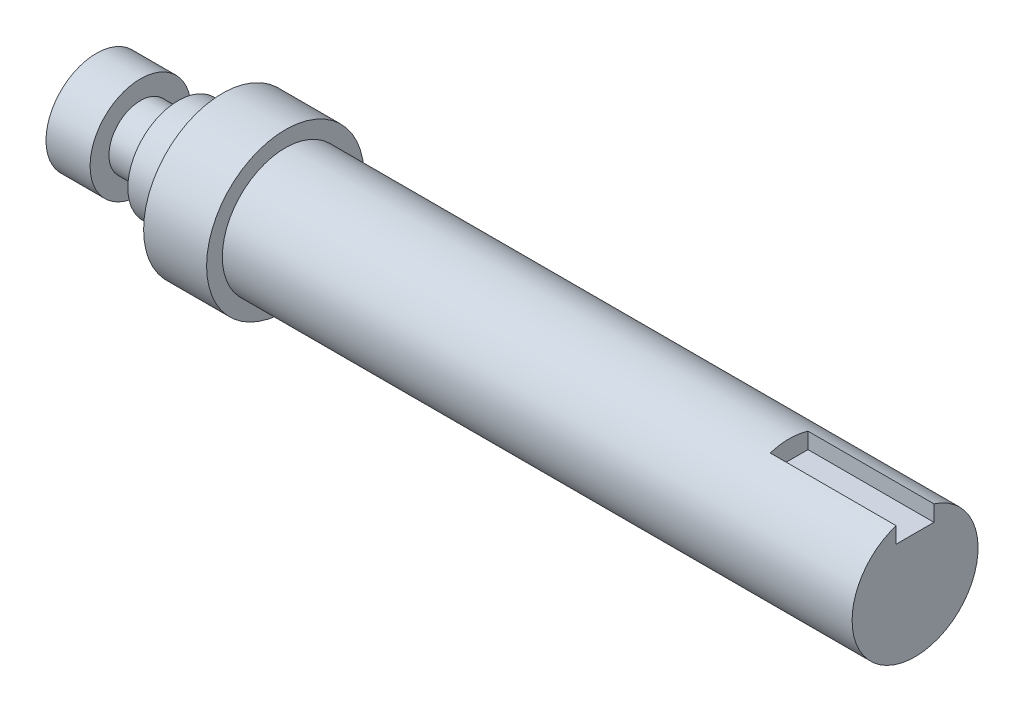
ISO-10303-21;
HEADER;
FILE_DESCRIPTION(('STEP AP214'),'2;1');
FILE_NAME('part.step','',(''),(''),'','','');
FILE_SCHEMA(('AUTOMOTIVE_DESIGN { 1 0 10303 214 1 1 1 1 }'));
ENDSEC;
DATA;
#1=APPLICATION_CONTEXT('core data for automotive mechanical design processes');
#2=APPLICATION_PROTOCOL_DEFINITION('international standard','automotive_design',2000,#1);
#3=PRODUCT_CONTEXT('',#1,'mechanical');
#4=PRODUCT('Part','Part','',(#3));
#5=PRODUCT_RELATED_PRODUCT_CATEGORY('part','',(#4));
#6=PRODUCT_DEFINITION_FORMATION('','',#4);
#7=PRODUCT_DEFINITION_CONTEXT('part definition',#1,'design');
#8=PRODUCT_DEFINITION('design','',#6,#7);
#9=PRODUCT_DEFINITION_SHAPE('','',#8);
#10=(LENGTH_UNIT() NAMED_UNIT(*) SI_UNIT(.MILLI.,.METRE.));
#11=(NAMED_UNIT(*) PLANE_ANGLE_UNIT() SI_UNIT($,.RADIAN.));
#12=(NAMED_UNIT(*) SI_UNIT($,.STERADIAN.) SOLID_ANGLE_UNIT());
#13=UNCERTAINTY_MEASURE_WITH_UNIT(LENGTH_MEASURE(1.E-05),#10,'distance_accuracy_value','');
#14=(GEOMETRIC_REPRESENTATION_CONTEXT(3) GLOBAL_UNCERTAINTY_ASSIGNED_CONTEXT((#13)) GLOBAL_UNIT_ASSIGNED_CONTEXT((#10,
#11,#12)) REPRESENTATION_CONTEXT('',''));
#15=CARTESIAN_POINT('',(0.,0.,0.));
#16=DIRECTION('',(0.,0.,1.));
#17=DIRECTION('',(1.,0.,0.));
#18=AXIS2_PLACEMENT_3D('',#15,#16,#17);
#19=CARTESIAN_POINT('',(-65.,0.,0.));
#20=DIRECTION('',(1.,0.,0.));
#21=DIRECTION('',(0.,0.,-1.));
#22=AXIS2_PLACEMENT_3D('',#19,#20,#21);
#23=PLANE('',#22);
#24=CARTESIAN_POINT('',(-65.,0.,0.));
#25=DIRECTION('',(-1.,0.,0.));
#26=DIRECTION('',(0.,0.,1.));
#27=AXIS2_PLACEMENT_3D('',#24,#25,#26);
#28=CIRCLE('',#27,8.00000000000001);
#29=CARTESIAN_POINT('',(-65.,0.,8.00000000000001));
#30=VERTEX_POINT('',#29);
#31=EDGE_CURVE('E11',#30,#30,#28,.T.);
#32=ORIENTED_EDGE('',*,*,#31,.T.);
#33=EDGE_LOOP('',(#32));
#34=FACE_BOUND('',#33,.T.);
#35=ADVANCED_FACE('F39',(#34),#23,.F.);
#36=CARTESIAN_POINT('',(-30.4262295081967,0.,0.));
#37=DIRECTION('',(-1.,0.,0.));
#38=DIRECTION('',(0.,0.,1.));
#39=AXIS2_PLACEMENT_3D('',#36,#37,#38);
#40=CYLINDRICAL_SURFACE('',#39,8.00000000000001);
#41=ORIENTED_EDGE('',*,*,#31,.F.);
#42=EDGE_LOOP('',(#41));
#43=FACE_BOUND('',#42,.T.);
#44=CARTESIAN_POINT('',(-58.,0.,0.));
#45=DIRECTION('',(-1.,0.,0.));
#46=DIRECTION('',(0.,0.,1.));
#47=AXIS2_PLACEMENT_3D('',#44,#45,#46);
#48=CIRCLE('',#47,8.00000000000001);
#49=CARTESIAN_POINT('',(-58.,0.,8.00000000000001));
#50=VERTEX_POINT('',#49);
#51=EDGE_CURVE('E47',#50,#50,#48,.T.);
#52=ORIENTED_EDGE('',*,*,#51,.T.);
#53=EDGE_LOOP('',(#52));
#54=FACE_BOUND('',#53,.T.);
#55=ADVANCED_FACE('F159',(#43,#54),#40,.T.);
#56=CARTESIAN_POINT('',(-58.,8.00000000000001,0.));
#57=DIRECTION('',(-1.,0.,0.));
#58=DIRECTION('',(0.,0.,1.));
#59=AXIS2_PLACEMENT_3D('',#56,#57,#58);
#60=PLANE('',#59);
#61=ORIENTED_EDGE('',*,*,#51,.F.);
#62=EDGE_LOOP('',(#61));
#63=FACE_BOUND('',#62,.T.);
#64=CARTESIAN_POINT('',(-58.,0.,0.));
#65=DIRECTION('',(-1.,0.,0.));
#66=DIRECTION('',(0.,0.,1.));
#67=AXIS2_PLACEMENT_3D('',#64,#65,#66);
#68=CIRCLE('',#67,5.00000000000001);
#69=CARTESIAN_POINT('',(-58.,0.,5.00000000000001));
#70=VERTEX_POINT('',#69);
#71=EDGE_CURVE('E152',#70,#70,#68,.T.);
#72=ORIENTED_EDGE('',*,*,#71,.T.);
#73=EDGE_LOOP('',(#72));
#74=FACE_BOUND('',#73,.T.);
#75=ADVANCED_FACE('F161',(#63,#74),#60,.F.);
#76=CARTESIAN_POINT('',(-30.4262295081967,0.,0.));
#77=DIRECTION('',(-1.,0.,0.));
#78=DIRECTION('',(0.,0.,1.));
#79=AXIS2_PLACEMENT_3D('',#76,#77,#78);
#80=CYLINDRICAL_SURFACE('',#79,5.00000000000001);
#81=ORIENTED_EDGE('',*,*,#71,.F.);
#82=EDGE_LOOP('',(#81));
#83=FACE_BOUND('',#82,.T.);
#84=CARTESIAN_POINT('',(-52.,0.,0.));
#85=DIRECTION('',(-1.,0.,0.));
#86=DIRECTION('',(0.,0.,1.));
#87=AXIS2_PLACEMENT_3D('',#84,#85,#86);
#88=CIRCLE('',#87,5.00000000000001);
#89=CARTESIAN_POINT('',(-52.,0.,5.00000000000001));
#90=VERTEX_POINT('',#89);
#91=EDGE_CURVE('E148',#90,#90,#88,.T.);
#92=ORIENTED_EDGE('',*,*,#91,.T.);
#93=EDGE_LOOP('',(#92));
#94=FACE_BOUND('',#93,.T.);
#95=ADVANCED_FACE('F164',(#83,#94),#80,.T.);
#96=CARTESIAN_POINT('',(-52.,5.00000000000001,0.));
#97=DIRECTION('',(1.,0.,0.));
#98=DIRECTION('',(0.,0.,-1.));
#99=AXIS2_PLACEMENT_3D('',#96,#97,#98);
#100=PLANE('',#99);
#101=ORIENTED_EDGE('',*,*,#91,.F.);
#102=EDGE_LOOP('',(#101));
#103=FACE_BOUND('',#102,.T.);
#104=CARTESIAN_POINT('',(-52.,0.,0.));
#105=DIRECTION('',(-1.,0.,0.));
#106=DIRECTION('',(0.,0.,1.));
#107=AXIS2_PLACEMENT_3D('',#104,#105,#106);
#108=CIRCLE('',#107,8.00000000000001);
#109=CARTESIAN_POINT('',(-52.,0.,8.00000000000001));
#110=VERTEX_POINT('',#109);
#111=EDGE_CURVE('E144',#110,#110,#108,.T.);
#112=ORIENTED_EDGE('',*,*,#111,.T.);
#113=EDGE_LOOP('',(#112));
#114=FACE_BOUND('',#113,.T.);
#115=ADVANCED_FACE('F170',(#103,#114),#100,.F.);
#116=CARTESIAN_POINT('',(-30.4262295081967,0.,0.));
#117=DIRECTION('',(-1.,0.,0.));
#118=DIRECTION('',(0.,0.,1.));
#119=AXIS2_PLACEMENT_3D('',#116,#117,#118);
#120=CYLINDRICAL_SURFACE('',#119,8.00000000000001);
#121=ORIENTED_EDGE('',*,*,#111,.F.);
#122=EDGE_LOOP('',(#121));
#123=FACE_BOUND('',#122,.T.);
#124=CARTESIAN_POINT('',(-45.,0.,0.));
#125=DIRECTION('',(-1.,0.,0.));
#126=DIRECTION('',(0.,0.,1.));
#127=AXIS2_PLACEMENT_3D('',#124,#125,#126);
#128=CIRCLE('',#127,8.00000000000001);
#129=CARTESIAN_POINT('',(-45.,0.,8.00000000000001));
#130=VERTEX_POINT('',#129);
#131=EDGE_CURVE('E140',#130,#130,#128,.T.);
#132=ORIENTED_EDGE('',*,*,#131,.T.);
#133=EDGE_LOOP('',(#132));
#134=FACE_BOUND('',#133,.T.);
#135=ADVANCED_FACE('F176',(#123,#134),#120,.T.);
#136=CARTESIAN_POINT('',(-45.,8.00000000000001,0.));
#137=DIRECTION('',(1.,0.,0.));
#138=DIRECTION('',(0.,0.,-1.));
#139=AXIS2_PLACEMENT_3D('',#136,#137,#138);
#140=PLANE('',#139);
#141=ORIENTED_EDGE('',*,*,#131,.F.);
#142=EDGE_LOOP('',(#141));
#143=FACE_BOUND('',#142,.T.);
#144=CARTESIAN_POINT('',(-45.,0.,0.));
#145=DIRECTION('',(-1.,0.,0.));
#146=DIRECTION('',(0.,0.,1.));
#147=AXIS2_PLACEMENT_3D('',#144,#145,#146);
#148=CIRCLE('',#147,12.5);
#149=CARTESIAN_POINT('',(-45.,0.,12.5));
#150=VERTEX_POINT('',#149);
#151=EDGE_CURVE('E136',#150,#150,#148,.T.);
#152=ORIENTED_EDGE('',*,*,#151,.T.);
#153=EDGE_LOOP('',(#152));
#154=FACE_BOUND('',#153,.T.);
#155=ADVANCED_FACE('F182',(#143,#154),#140,.F.);
#156=CARTESIAN_POINT('',(-30.4262295081967,0.,0.));
#157=DIRECTION('',(-1.,0.,0.));
#158=DIRECTION('',(0.,0.,1.));
#159=AXIS2_PLACEMENT_3D('',#156,#157,#158);
#160=CYLINDRICAL_SURFACE('',#159,12.5);
#161=ORIENTED_EDGE('',*,*,#151,.F.);
#162=EDGE_LOOP('',(#161));
#163=FACE_BOUND('',#162,.T.);
#164=CARTESIAN_POINT('',(-35.,0.,0.));
#165=DIRECTION('',(-1.,0.,0.));
#166=DIRECTION('',(0.,0.,1.));
#167=AXIS2_PLACEMENT_3D('',#164,#165,#166);
#168=CIRCLE('',#167,12.5);
#169=CARTESIAN_POINT('',(-35.,0.,12.5));
#170=VERTEX_POINT('',#169);
#171=EDGE_CURVE('E132',#170,#170,#168,.T.);
#172=ORIENTED_EDGE('',*,*,#171,.T.);
#173=EDGE_LOOP('',(#172));
#174=FACE_BOUND('',#173,.T.);
#175=ADVANCED_FACE('F188',(#163,#174),#160,.T.);
#176=CARTESIAN_POINT('',(-35.,12.5,0.));
#177=DIRECTION('',(-1.,0.,0.));
#178=DIRECTION('',(0.,0.,1.));
#179=AXIS2_PLACEMENT_3D('',#176,#177,#178);
#180=PLANE('',#179);
#181=ORIENTED_EDGE('',*,*,#171,.F.);
#182=EDGE_LOOP('',(#181));
#183=FACE_BOUND('',#182,.T.);
#184=CARTESIAN_POINT('',(-35.,0.,0.));
#185=DIRECTION('',(-1.,0.,0.));
#186=DIRECTION('',(0.,0.,1.));
#187=AXIS2_PLACEMENT_3D('',#184,#185,#186);
#188=CIRCLE('',#187,10.);
#189=CARTESIAN_POINT('',(-35.,0.,10.));
#190=VERTEX_POINT('',#189);
#191=EDGE_CURVE('E128',#190,#190,#188,.T.);
#192=ORIENTED_EDGE('',*,*,#191,.T.);
#193=EDGE_LOOP('',(#192));
#194=FACE_BOUND('',#193,.T.);
#195=ADVANCED_FACE('F194',(#183,#194),#180,.F.);
#196=CARTESIAN_POINT('',(-30.4262295081967,0.,0.));
#197=DIRECTION('',(-1.,0.,0.));
#198=DIRECTION('',(0.,0.,1.));
#199=AXIS2_PLACEMENT_3D('',#196,#197,#198);
#200=CYLINDRICAL_SURFACE('',#199,10.);
#201=ORIENTED_EDGE('',*,*,#191,.F.);
#202=EDGE_LOOP('',(#201));
#203=FACE_BOUND('',#202,.T.);
#204=CARTESIAN_POINT('',(45.,0.,0.));
#205=DIRECTION('',(1.,0.,0.));
#206=DIRECTION('',(0.,0.,-1.));
#207=AXIS2_PLACEMENT_3D('',#204,#205,#206);
#208=CIRCLE('',#207,10.);
#209=CARTESIAN_POINT('',(45.,9.53939201416947,-3.));
#210=VERTEX_POINT('',#209);
#211=CARTESIAN_POINT('',(45.,9.53939201416947,3.));
#212=VERTEX_POINT('',#211);
#213=EDGE_CURVE('E103',#210,#212,#208,.T.);
#214=ORIENTED_EDGE('',*,*,#213,.F.);
#215=DIRECTION('',(1.,0.,0.));
#216=VECTOR('',#215,1.);
#217=CARTESIAN_POINT('',(45.,9.53939201416947,-3.));
#218=LINE('',#217,#216);
#219=CARTESIAN_POINT('',(65.,9.53939201416947,-3.));
#220=VERTEX_POINT('',#219);
#221=EDGE_CURVE('E63',#210,#220,#218,.T.);
#222=ORIENTED_EDGE('',*,*,#221,.T.);
#223=CARTESIAN_POINT('',(65.,0.,0.));
#224=DIRECTION('',(-1.,0.,0.));
#225=DIRECTION('',(0.,0.,1.));
#226=AXIS2_PLACEMENT_3D('',#223,#224,#225);
#227=CIRCLE('',#226,10.);
#228=CARTESIAN_POINT('',(65.,9.53939201416945,3.));
#229=VERTEX_POINT('',#228);
#230=EDGE_CURVE('E120',#220,#229,#227,.T.);
#231=ORIENTED_EDGE('',*,*,#230,.T.);
#232=DIRECTION('',(1.,0.,0.));
#233=VECTOR('',#232,1.);
#234=CARTESIAN_POINT('',(45.,9.53939201416947,3.));
#235=LINE('',#234,#233);
#236=EDGE_CURVE('E54',#212,#229,#235,.T.);
#237=ORIENTED_EDGE('',*,*,#236,.F.);
#238=EDGE_LOOP('',(#214,#222,#231,#237));
#239=FACE_BOUND('',#238,.T.);
#240=ADVANCED_FACE('F200',(#203,#239),#200,.T.);
#241=CARTESIAN_POINT('',(65.,10.,0.));
#242=DIRECTION('',(-1.,0.,0.));
#243=DIRECTION('',(0.,0.,1.));
#244=AXIS2_PLACEMENT_3D('',#241,#242,#243);
#245=PLANE('',#244);
#246=ORIENTED_EDGE('',*,*,#230,.F.);
#247=DIRECTION('',(0.,1.,0.));
#248=VECTOR('',#247,1.);
#249=CARTESIAN_POINT('',(65.,7.,-3.));
#250=LINE('',#249,#248);
#251=CARTESIAN_POINT('',(65.,7.,-3.));
#252=VERTEX_POINT('',#251);
#253=EDGE_CURVE('E78',#252,#220,#250,.T.);
#254=ORIENTED_EDGE('',*,*,#253,.F.);
#255=DIRECTION('',(0.,0.,-1.));
#256=VECTOR('',#255,1.);
#257=CARTESIAN_POINT('',(65.,7.,3.));
#258=LINE('',#257,#256);
#259=CARTESIAN_POINT('',(65.,7.,3.));
#260=VERTEX_POINT('',#259);
#261=EDGE_CURVE('E113',#260,#252,#258,.T.);
#262=ORIENTED_EDGE('',*,*,#261,.F.);
#263=DIRECTION('',(0.,-1.,0.));
#264=VECTOR('',#263,1.);
#265=CARTESIAN_POINT('',(65.,9.53939201416947,3.));
#266=LINE('',#265,#264);
#267=EDGE_CURVE('E87',#229,#260,#266,.T.);
#268=ORIENTED_EDGE('',*,*,#267,.F.);
#269=EDGE_LOOP('',(#246,#254,#262,#268));
#270=FACE_BOUND('',#269,.T.);
#271=ADVANCED_FACE('F206',(#270),#245,.F.);
#272=CARTESIAN_POINT('',(45.,7.,-3.));
#273=DIRECTION('',(0.,0.,-1.));
#274=DIRECTION('',(0.,1.,0.));
#275=AXIS2_PLACEMENT_3D('',#272,#273,#274);
#276=PLANE('',#275);
#277=ORIENTED_EDGE('',*,*,#253,.T.);
#278=ORIENTED_EDGE('',*,*,#221,.F.);
#279=DIRECTION('',(0.,1.,0.));
#280=VECTOR('',#279,1.);
#281=CARTESIAN_POINT('',(45.,7.,-3.));
#282=LINE('',#281,#280);
#283=CARTESIAN_POINT('',(45.,7.,-3.));
#284=VERTEX_POINT('',#283);
#285=EDGE_CURVE('E99',#284,#210,#282,.T.);
#286=ORIENTED_EDGE('',*,*,#285,.F.);
#287=DIRECTION('',(1.,0.,0.));
#288=VECTOR('',#287,1.);
#289=CARTESIAN_POINT('',(45.,7.,-3.));
#290=LINE('',#289,#288);
#291=EDGE_CURVE('E92',#284,#252,#290,.T.);
#292=ORIENTED_EDGE('',*,*,#291,.T.);
#293=EDGE_LOOP('',(#277,#278,#286,#292));
#294=FACE_BOUND('',#293,.T.);
#295=ADVANCED_FACE('F211',(#294),#276,.F.);
#296=CARTESIAN_POINT('',(45.,7.,3.));
#297=DIRECTION('',(0.,-1.,0.));
#298=DIRECTION('',(0.,0.,-1.));
#299=AXIS2_PLACEMENT_3D('',#296,#297,#298);
#300=PLANE('',#299);
#301=ORIENTED_EDGE('',*,*,#261,.T.);
#302=ORIENTED_EDGE('',*,*,#291,.F.);
#303=DIRECTION('',(0.,0.,-1.));
#304=VECTOR('',#303,1.);
#305=CARTESIAN_POINT('',(45.,7.,3.));
#306=LINE('',#305,#304);
#307=CARTESIAN_POINT('',(45.,7.,3.));
#308=VERTEX_POINT('',#307);
#309=EDGE_CURVE('E95',#308,#284,#306,.T.);
#310=ORIENTED_EDGE('',*,*,#309,.F.);
#311=DIRECTION('',(1.,0.,0.));
#312=VECTOR('',#311,1.);
#313=CARTESIAN_POINT('',(45.,7.,3.));
#314=LINE('',#313,#312);
#315=EDGE_CURVE('E84',#308,#260,#314,.T.);
#316=ORIENTED_EDGE('',*,*,#315,.T.);
#317=EDGE_LOOP('',(#301,#302,#310,#316));
#318=FACE_BOUND('',#317,.T.);
#319=ADVANCED_FACE('F96',(#318),#300,.F.);
#320=CARTESIAN_POINT('',(45.,9.53939201416947,3.));
#321=DIRECTION('',(0.,0.,1.));
#322=DIRECTION('',(0.,-1.,0.));
#323=AXIS2_PLACEMENT_3D('',#320,#321,#322);
#324=PLANE('',#323);
#325=ORIENTED_EDGE('',*,*,#267,.T.);
#326=ORIENTED_EDGE('',*,*,#315,.F.);
#327=DIRECTION('',(0.,-1.,0.));
#328=VECTOR('',#327,1.);
#329=CARTESIAN_POINT('',(45.,9.53939201416947,3.));
#330=LINE('',#329,#328);
#331=EDGE_CURVE('E82',#212,#308,#330,.T.);
#332=ORIENTED_EDGE('',*,*,#331,.F.);
#333=ORIENTED_EDGE('',*,*,#236,.T.);
#334=EDGE_LOOP('',(#325,#326,#332,#333));
#335=FACE_BOUND('',#334,.T.);
#336=ADVANCED_FACE('F86',(#335),#324,.F.);
#337=CARTESIAN_POINT('',(45.,0.,0.));
#338=DIRECTION('',(1.,0.,0.));
#339=DIRECTION('',(0.,0.,-1.));
#340=AXIS2_PLACEMENT_3D('',#337,#338,#339);
#341=PLANE('',#340);
#342=ORIENTED_EDGE('',*,*,#213,.T.);
#343=ORIENTED_EDGE('',*,*,#331,.T.);
#344=ORIENTED_EDGE('',*,*,#309,.T.);
#345=ORIENTED_EDGE('',*,*,#285,.T.);
#346=EDGE_LOOP('',(#342,#343,#344,#345));
#347=FACE_BOUND('',#346,.T.);
#348=ADVANCED_FACE('F101',(#347),#341,.T.);
#349=CLOSED_SHELL('',(#35,#55,#75,#95,#115,#135,#155,#175,#195,#240,#271,#295,#319,#336,#348));
#350=MANIFOLD_SOLID_BREP('B2',#349);
#351=ADVANCED_BREP_SHAPE_REPRESENTATION('',(#18,#350),#14);
#352=SHAPE_DEFINITION_REPRESENTATION(#9,#351);
ENDSEC;
END-ISO-10303-21;
